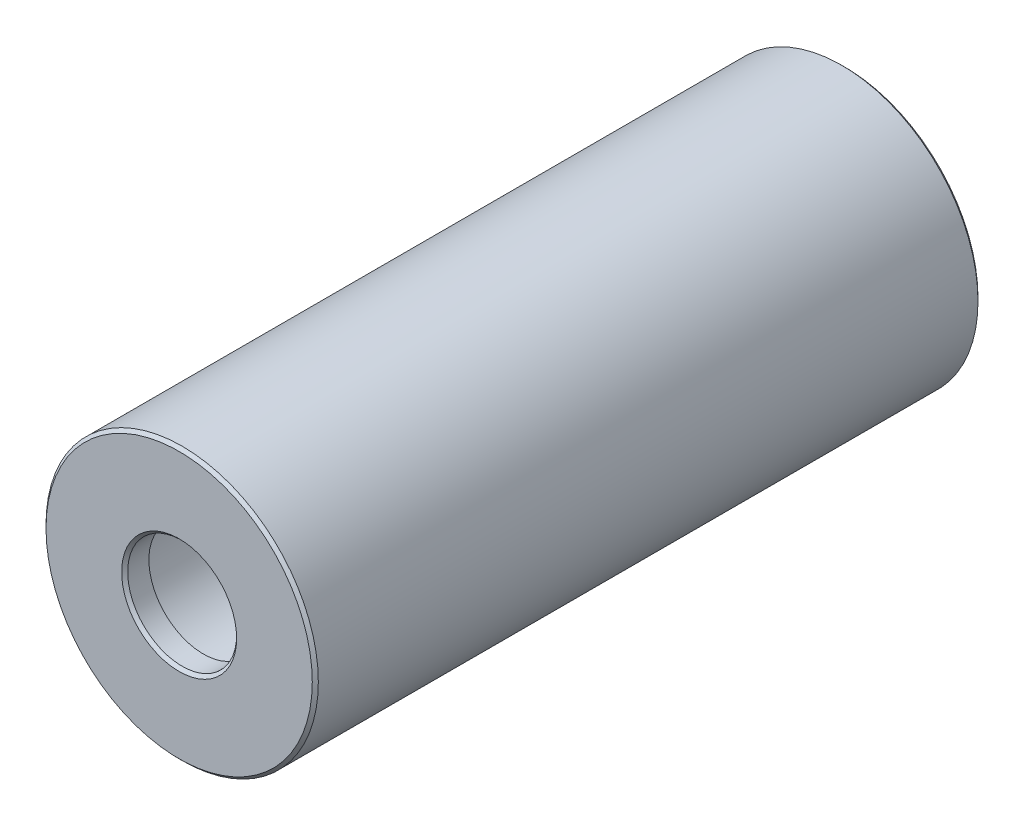
ISO-10303-21;
HEADER;
FILE_DESCRIPTION(('STEP AP214'),'2;1');
FILE_NAME('part.step','',(''),(''),'','','');
FILE_SCHEMA(('AUTOMOTIVE_DESIGN { 1 0 10303 214 1 1 1 1 }'));
ENDSEC;
DATA;
#1=APPLICATION_CONTEXT('core data for automotive mechanical design processes');
#2=APPLICATION_PROTOCOL_DEFINITION('international standard','automotive_design',2000,#1);
#3=PRODUCT_CONTEXT('',#1,'mechanical');
#4=PRODUCT('Part','Part','',(#3));
#5=PRODUCT_RELATED_PRODUCT_CATEGORY('part','',(#4));
#6=PRODUCT_DEFINITION_FORMATION('','',#4);
#7=PRODUCT_DEFINITION_CONTEXT('part definition',#1,'design');
#8=PRODUCT_DEFINITION('design','',#6,#7);
#9=PRODUCT_DEFINITION_SHAPE('','',#8);
#10=(LENGTH_UNIT() NAMED_UNIT(*) SI_UNIT(.MILLI.,.METRE.));
#11=(NAMED_UNIT(*) PLANE_ANGLE_UNIT() SI_UNIT($,.RADIAN.));
#12=(NAMED_UNIT(*) SI_UNIT($,.STERADIAN.) SOLID_ANGLE_UNIT());
#13=UNCERTAINTY_MEASURE_WITH_UNIT(LENGTH_MEASURE(1.E-05),#10,'distance_accuracy_value','');
#14=(GEOMETRIC_REPRESENTATION_CONTEXT(3) GLOBAL_UNCERTAINTY_ASSIGNED_CONTEXT((#13)) GLOBAL_UNIT_ASSIGNED_CONTEXT((#10,
#11,#12)) REPRESENTATION_CONTEXT('',''));
#15=CARTESIAN_POINT('',(0.,0.,0.));
#16=DIRECTION('',(0.,0.,1.));
#17=DIRECTION('',(1.,0.,0.));
#18=AXIS2_PLACEMENT_3D('',#15,#16,#17);
#19=CARTESIAN_POINT('',(0.,0.,0.));
#20=DIRECTION('',(0.,0.,1.));
#21=DIRECTION('',(1.,0.,0.));
#22=AXIS2_PLACEMENT_3D('',#19,#20,#21);
#23=CYLINDRICAL_SURFACE('',#22,22.5);
#24=CARTESIAN_POINT('',(0.,0.,-109.5));
#25=DIRECTION('',(0.,0.,1.));
#26=DIRECTION('',(1.,0.,0.));
#27=AXIS2_PLACEMENT_3D('',#24,#25,#26);
#28=CIRCLE('',#27,22.5);
#29=CARTESIAN_POINT('',(22.5,0.,-109.5));
#30=VERTEX_POINT('',#29);
#31=EDGE_CURVE('E52',#30,#30,#28,.T.);
#32=ORIENTED_EDGE('',*,*,#31,.T.);
#33=EDGE_LOOP('',(#32));
#34=FACE_BOUND('',#33,.T.);
#35=CARTESIAN_POINT('',(0.,0.,-0.500000000000035));
#36=DIRECTION('',(0.,0.,-1.));
#37=DIRECTION('',(-1.,0.,0.));
#38=AXIS2_PLACEMENT_3D('',#35,#36,#37);
#39=CIRCLE('',#38,22.5);
#40=CARTESIAN_POINT('',(-22.5,0.,-0.500000000000035));
#41=VERTEX_POINT('',#40);
#42=EDGE_CURVE('E57',#41,#41,#39,.T.);
#43=ORIENTED_EDGE('',*,*,#42,.T.);
#44=EDGE_LOOP('',(#43));
#45=FACE_BOUND('',#44,.T.);
#46=ADVANCED_FACE('F38',(#34,#45),#23,.T.);
#47=CARTESIAN_POINT('',(0.,22.5,-110.));
#48=DIRECTION('',(0.,0.,1.));
#49=DIRECTION('',(1.,0.,0.));
#50=AXIS2_PLACEMENT_3D('',#47,#48,#49);
#51=PLANE('',#50);
#52=CARTESIAN_POINT('',(0.,0.,-110.));
#53=DIRECTION('',(0.,0.,1.));
#54=DIRECTION('',(1.,0.,0.));
#55=AXIS2_PLACEMENT_3D('',#52,#53,#54);
#56=CIRCLE('',#55,22.);
#57=CARTESIAN_POINT('',(22.,0.,-110.));
#58=VERTEX_POINT('',#57);
#59=EDGE_CURVE('E47',#58,#58,#56,.F.);
#60=ORIENTED_EDGE('',*,*,#59,.T.);
#61=EDGE_LOOP('',(#60));
#62=FACE_BOUND('',#61,.T.);
#63=CARTESIAN_POINT('',(0.,0.,-110.));
#64=DIRECTION('',(0.,0.,1.));
#65=DIRECTION('',(1.,0.,0.));
#66=AXIS2_PLACEMENT_3D('',#63,#64,#65);
#67=CIRCLE('',#66,17.5);
#68=CARTESIAN_POINT('',(17.5,0.,-110.));
#69=VERTEX_POINT('',#68);
#70=EDGE_CURVE('E63',#69,#69,#67,.T.);
#71=ORIENTED_EDGE('',*,*,#70,.T.);
#72=EDGE_LOOP('',(#71));
#73=FACE_BOUND('',#72,.T.);
#74=ADVANCED_FACE('F117',(#62,#73),#51,.F.);
#75=CARTESIAN_POINT('',(0.,0.,-109.5));
#76=DIRECTION('',(0.,0.,-1.));
#77=DIRECTION('',(-1.,0.,0.));
#78=AXIS2_PLACEMENT_3D('',#75,#76,#77);
#79=CONICAL_SURFACE('',#78,17.,0.785398163397448);
#80=ORIENTED_EDGE('',*,*,#70,.F.);
#81=EDGE_LOOP('',(#80));
#82=FACE_BOUND('',#81,.T.);
#83=CARTESIAN_POINT('',(0.,0.,-109.5));
#84=DIRECTION('',(0.,0.,1.));
#85=DIRECTION('',(1.,0.,0.));
#86=AXIS2_PLACEMENT_3D('',#83,#84,#85);
#87=CIRCLE('',#86,17.);
#88=CARTESIAN_POINT('',(17.,0.,-109.5));
#89=VERTEX_POINT('',#88);
#90=EDGE_CURVE('E67',#89,#89,#87,.T.);
#91=ORIENTED_EDGE('',*,*,#90,.T.);
#92=EDGE_LOOP('',(#91));
#93=FACE_BOUND('',#92,.T.);
#94=ADVANCED_FACE('F123',(#82,#93),#79,.F.);
#95=CARTESIAN_POINT('',(0.,0.,0.));
#96=DIRECTION('',(0.,0.,1.));
#97=DIRECTION('',(1.,0.,0.));
#98=AXIS2_PLACEMENT_3D('',#95,#96,#97);
#99=CYLINDRICAL_SURFACE('',#98,17.);
#100=ORIENTED_EDGE('',*,*,#90,.F.);
#101=EDGE_LOOP('',(#100));
#102=FACE_BOUND('',#101,.T.);
#103=CARTESIAN_POINT('',(0.,0.,-64.));
#104=DIRECTION('',(0.,0.,1.));
#105=DIRECTION('',(1.,0.,0.));
#106=AXIS2_PLACEMENT_3D('',#103,#104,#105);
#107=CIRCLE('',#106,17.);
#108=CARTESIAN_POINT('',(17.,0.,-64.));
#109=VERTEX_POINT('',#108);
#110=EDGE_CURVE('E71',#109,#109,#107,.T.);
#111=ORIENTED_EDGE('',*,*,#110,.T.);
#112=EDGE_LOOP('',(#111));
#113=FACE_BOUND('',#112,.T.);
#114=ADVANCED_FACE('F134',(#102,#113),#99,.F.);
#115=CARTESIAN_POINT('',(0.,17.,-64.));
#116=DIRECTION('',(0.,0.,1.));
#117=DIRECTION('',(1.,0.,0.));
#118=AXIS2_PLACEMENT_3D('',#115,#116,#117);
#119=PLANE('',#118);
#120=ORIENTED_EDGE('',*,*,#110,.F.);
#121=EDGE_LOOP('',(#120));
#122=FACE_BOUND('',#121,.T.);
#123=CARTESIAN_POINT('',(0.,0.,-64.));
#124=DIRECTION('',(0.,0.,1.));
#125=DIRECTION('',(1.,0.,0.));
#126=AXIS2_PLACEMENT_3D('',#123,#124,#125);
#127=CIRCLE('',#126,12.5);
#128=CARTESIAN_POINT('',(12.5,0.,-64.));
#129=VERTEX_POINT('',#128);
#130=EDGE_CURVE('E75',#129,#129,#127,.T.);
#131=ORIENTED_EDGE('',*,*,#130,.T.);
#132=EDGE_LOOP('',(#131));
#133=FACE_BOUND('',#132,.T.);
#134=ADVANCED_FACE('F138',(#122,#133),#119,.F.);
#135=CARTESIAN_POINT('',(0.,0.,-63.5));
#136=DIRECTION('',(0.,0.,-1.));
#137=DIRECTION('',(-1.,0.,0.));
#138=AXIS2_PLACEMENT_3D('',#135,#136,#137);
#139=CONICAL_SURFACE('',#138,12.,0.785398163397448);
#140=ORIENTED_EDGE('',*,*,#130,.F.);
#141=EDGE_LOOP('',(#140));
#142=FACE_BOUND('',#141,.T.);
#143=CARTESIAN_POINT('',(0.,0.,-63.5));
#144=DIRECTION('',(0.,0.,1.));
#145=DIRECTION('',(1.,0.,0.));
#146=AXIS2_PLACEMENT_3D('',#143,#144,#145);
#147=CIRCLE('',#146,12.);
#148=CARTESIAN_POINT('',(12.,0.,-63.5));
#149=VERTEX_POINT('',#148);
#150=EDGE_CURVE('E79',#149,#149,#147,.T.);
#151=ORIENTED_EDGE('',*,*,#150,.T.);
#152=EDGE_LOOP('',(#151));
#153=FACE_BOUND('',#152,.T.);
#154=ADVANCED_FACE('F142',(#142,#153),#139,.F.);
#155=CARTESIAN_POINT('',(0.,0.,0.));
#156=DIRECTION('',(0.,0.,1.));
#157=DIRECTION('',(1.,0.,0.));
#158=AXIS2_PLACEMENT_3D('',#155,#156,#157);
#159=CYLINDRICAL_SURFACE('',#158,12.);
#160=ORIENTED_EDGE('',*,*,#150,.F.);
#161=EDGE_LOOP('',(#160));
#162=FACE_BOUND('',#161,.T.);
#163=CARTESIAN_POINT('',(0.,0.,-4.));
#164=DIRECTION('',(0.,0.,1.));
#165=DIRECTION('',(1.,0.,0.));
#166=AXIS2_PLACEMENT_3D('',#163,#164,#165);
#167=CIRCLE('',#166,12.);
#168=CARTESIAN_POINT('',(12.,0.,-4.));
#169=VERTEX_POINT('',#168);
#170=EDGE_CURVE('E83',#169,#169,#167,.T.);
#171=ORIENTED_EDGE('',*,*,#170,.T.);
#172=EDGE_LOOP('',(#171));
#173=FACE_BOUND('',#172,.T.);
#174=ADVANCED_FACE('F146',(#162,#173),#159,.F.);
#175=CARTESIAN_POINT('',(0.,12.,-4.));
#176=DIRECTION('',(0.,0.,1.));
#177=DIRECTION('',(1.,0.,0.));
#178=AXIS2_PLACEMENT_3D('',#175,#176,#177);
#179=PLANE('',#178);
#180=ORIENTED_EDGE('',*,*,#170,.F.);
#181=EDGE_LOOP('',(#180));
#182=FACE_BOUND('',#181,.T.);
#183=CARTESIAN_POINT('',(0.,0.,-4.));
#184=DIRECTION('',(0.,0.,1.));
#185=DIRECTION('',(1.,0.,0.));
#186=AXIS2_PLACEMENT_3D('',#183,#184,#185);
#187=CIRCLE('',#186,9.);
#188=CARTESIAN_POINT('',(9.,0.,-4.));
#189=VERTEX_POINT('',#188);
#190=EDGE_CURVE('E87',#189,#189,#187,.T.);
#191=ORIENTED_EDGE('',*,*,#190,.T.);
#192=EDGE_LOOP('',(#191));
#193=FACE_BOUND('',#192,.T.);
#194=ADVANCED_FACE('F150',(#182,#193),#179,.F.);
#195=CARTESIAN_POINT('',(0.,0.,0.));
#196=DIRECTION('',(0.,0.,1.));
#197=DIRECTION('',(1.,0.,0.));
#198=AXIS2_PLACEMENT_3D('',#195,#196,#197);
#199=CYLINDRICAL_SURFACE('',#198,9.);
#200=ORIENTED_EDGE('',*,*,#190,.F.);
#201=EDGE_LOOP('',(#200));
#202=FACE_BOUND('',#201,.T.);
#203=CARTESIAN_POINT('',(0.,0.,-0.5));
#204=DIRECTION('',(0.,0.,1.));
#205=DIRECTION('',(1.,0.,0.));
#206=AXIS2_PLACEMENT_3D('',#203,#204,#205);
#207=CIRCLE('',#206,9.);
#208=CARTESIAN_POINT('',(9.,0.,-0.5));
#209=VERTEX_POINT('',#208);
#210=EDGE_CURVE('E91',#209,#209,#207,.T.);
#211=ORIENTED_EDGE('',*,*,#210,.T.);
#212=EDGE_LOOP('',(#211));
#213=FACE_BOUND('',#212,.T.);
#214=ADVANCED_FACE('F113',(#202,#213),#199,.F.);
#215=CARTESIAN_POINT('',(0.,0.,0.));
#216=DIRECTION('',(0.,0.,1.));
#217=DIRECTION('',(1.,0.,0.));
#218=AXIS2_PLACEMENT_3D('',#215,#216,#217);
#219=CONICAL_SURFACE('',#218,9.5,0.785398163397447);
#220=ORIENTED_EDGE('',*,*,#210,.F.);
#221=EDGE_LOOP('',(#220));
#222=FACE_BOUND('',#221,.T.);
#223=CARTESIAN_POINT('',(0.,0.,0.));
#224=DIRECTION('',(0.,0.,1.));
#225=DIRECTION('',(1.,0.,0.));
#226=AXIS2_PLACEMENT_3D('',#223,#224,#225);
#227=CIRCLE('',#226,9.5);
#228=CARTESIAN_POINT('',(9.5,0.,0.));
#229=VERTEX_POINT('',#228);
#230=EDGE_CURVE('E95',#229,#229,#227,.T.);
#231=ORIENTED_EDGE('',*,*,#230,.T.);
#232=EDGE_LOOP('',(#231));
#233=FACE_BOUND('',#232,.T.);
#234=ADVANCED_FACE('F100',(#222,#233),#219,.F.);
#235=CARTESIAN_POINT('',(0.,9.5,0.));
#236=DIRECTION('',(0.,0.,-1.));
#237=DIRECTION('',(-1.,0.,0.));
#238=AXIS2_PLACEMENT_3D('',#235,#236,#237);
#239=PLANE('',#238);
#240=CARTESIAN_POINT('',(0.,0.,0.));
#241=DIRECTION('',(0.,0.,-1.));
#242=DIRECTION('',(-1.,0.,0.));
#243=AXIS2_PLACEMENT_3D('',#240,#241,#242);
#244=CIRCLE('',#243,22.);
#245=CARTESIAN_POINT('',(-22.,0.,0.));
#246=VERTEX_POINT('',#245);
#247=EDGE_CURVE('E10',#246,#246,#244,.F.);
#248=ORIENTED_EDGE('',*,*,#247,.T.);
#249=EDGE_LOOP('',(#248));
#250=FACE_BOUND('',#249,.T.);
#251=ORIENTED_EDGE('',*,*,#230,.F.);
#252=EDGE_LOOP('',(#251));
#253=FACE_BOUND('',#252,.T.);
#254=ADVANCED_FACE('F102',(#250,#253),#239,.F.);
#255=CARTESIAN_POINT('',(0.,0.,-109.5));
#256=DIRECTION('',(0.,0.,1.));
#257=DIRECTION('',(1.,0.,0.));
#258=AXIS2_PLACEMENT_3D('',#255,#256,#257);
#259=CONICAL_SURFACE('',#258,22.5,0.785398163397428);
#260=ORIENTED_EDGE('',*,*,#59,.F.);
#261=EDGE_LOOP('',(#260));
#262=FACE_BOUND('',#261,.T.);
#263=ORIENTED_EDGE('',*,*,#31,.F.);
#264=EDGE_LOOP('',(#263));
#265=FACE_BOUND('',#264,.T.);
#266=ADVANCED_FACE('F104',(#262,#265),#259,.T.);
#267=CARTESIAN_POINT('',(0.,0.,0.));
#268=DIRECTION('',(0.,0.,-1.));
#269=DIRECTION('',(-1.,0.,0.));
#270=AXIS2_PLACEMENT_3D('',#267,#268,#269);
#271=CONICAL_SURFACE('',#270,22.,0.785398163397448);
#272=ORIENTED_EDGE('',*,*,#42,.F.);
#273=EDGE_LOOP('',(#272));
#274=FACE_BOUND('',#273,.T.);
#275=ORIENTED_EDGE('',*,*,#247,.F.);
#276=EDGE_LOOP('',(#275));
#277=FACE_BOUND('',#276,.T.);
#278=ADVANCED_FACE('F41',(#274,#277),#271,.T.);
#279=CLOSED_SHELL('',(#46,#74,#94,#114,#134,#154,#174,#194,#214,#234,#254,#266,#278));
#280=MANIFOLD_SOLID_BREP('B2',#279);
#281=ADVANCED_BREP_SHAPE_REPRESENTATION('',(#18,#280),#14);
#282=SHAPE_DEFINITION_REPRESENTATION(#9,#281);
ENDSEC;
END-ISO-10303-21;
